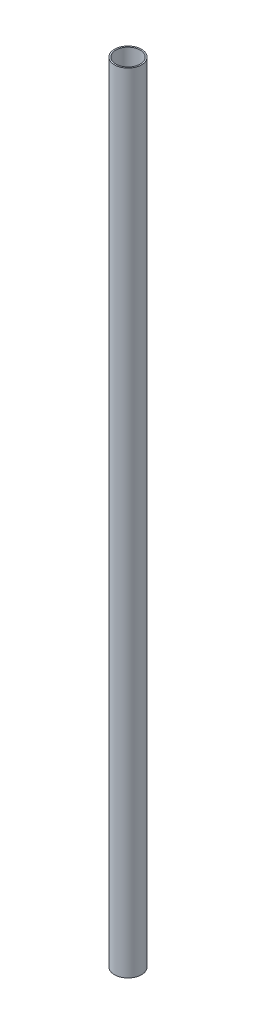
ISO-10303-21;
HEADER;
FILE_DESCRIPTION(('STEP AP214'),'2;1');
FILE_NAME('part.step','',(''),(''),'','','');
FILE_SCHEMA(('AUTOMOTIVE_DESIGN { 1 0 10303 214 1 1 1 1 }'));
ENDSEC;
DATA;
#1=APPLICATION_CONTEXT('core data for automotive mechanical design processes');
#2=APPLICATION_PROTOCOL_DEFINITION('international standard','automotive_design',2000,#1);
#3=PRODUCT_CONTEXT('',#1,'mechanical');
#4=PRODUCT('Part','Part','',(#3));
#5=PRODUCT_RELATED_PRODUCT_CATEGORY('part','',(#4));
#6=PRODUCT_DEFINITION_FORMATION('','',#4);
#7=PRODUCT_DEFINITION_CONTEXT('part definition',#1,'design');
#8=PRODUCT_DEFINITION('design','',#6,#7);
#9=PRODUCT_DEFINITION_SHAPE('','',#8);
#10=(LENGTH_UNIT() NAMED_UNIT(*) SI_UNIT(.MILLI.,.METRE.));
#11=(NAMED_UNIT(*) PLANE_ANGLE_UNIT() SI_UNIT($,.RADIAN.));
#12=(NAMED_UNIT(*) SI_UNIT($,.STERADIAN.) SOLID_ANGLE_UNIT());
#13=UNCERTAINTY_MEASURE_WITH_UNIT(LENGTH_MEASURE(1.E-05),#10,'distance_accuracy_value','');
#14=(GEOMETRIC_REPRESENTATION_CONTEXT(3) GLOBAL_UNCERTAINTY_ASSIGNED_CONTEXT((#13)) GLOBAL_UNIT_ASSIGNED_CONTEXT((#10,
#11,#12)) REPRESENTATION_CONTEXT('',''));
#15=CARTESIAN_POINT('',(0.,0.,0.));
#16=DIRECTION('',(0.,0.,1.));
#17=DIRECTION('',(1.,0.,0.));
#18=AXIS2_PLACEMENT_3D('',#15,#16,#17);
#19=CARTESIAN_POINT('',(0.,0.,0.));
#20=DIRECTION('',(0.,1.,0.));
#21=DIRECTION('',(0.,0.,1.));
#22=AXIS2_PLACEMENT_3D('',#19,#20,#21);
#23=PLANE('',#22);
#24=CARTESIAN_POINT('',(0.,0.,0.));
#25=DIRECTION('',(0.,1.,0.));
#26=DIRECTION('',(0.,0.,1.));
#27=AXIS2_PLACEMENT_3D('',#24,#25,#26);
#28=CIRCLE('',#27,4.5);
#29=CARTESIAN_POINT('',(0.,0.,4.5));
#30=VERTEX_POINT('',#29);
#31=EDGE_CURVE('E54',#30,#30,#28,.T.);
#32=ORIENTED_EDGE('',*,*,#31,.T.);
#33=EDGE_LOOP('',(#32));
#34=FACE_BOUND('',#33,.T.);
#35=CARTESIAN_POINT('',(0.,0.,0.));
#36=DIRECTION('',(0.,1.,0.));
#37=DIRECTION('',(0.,0.,1.));
#38=AXIS2_PLACEMENT_3D('',#35,#36,#37);
#39=CIRCLE('',#38,5.);
#40=CARTESIAN_POINT('',(0.,0.,5.));
#41=VERTEX_POINT('',#40);
#42=EDGE_CURVE('E50',#41,#41,#39,.T.);
#43=ORIENTED_EDGE('',*,*,#42,.F.);
#44=EDGE_LOOP('',(#43));
#45=FACE_BOUND('',#44,.T.);
#46=ADVANCED_FACE('F41',(#34,#45),#23,.F.);
#47=CARTESIAN_POINT('',(0.,291.,0.));
#48=DIRECTION('',(0.,1.,0.));
#49=DIRECTION('',(0.,0.,1.));
#50=AXIS2_PLACEMENT_3D('',#47,#48,#49);
#51=PLANE('',#50);
#52=CARTESIAN_POINT('',(0.,291.,0.));
#53=DIRECTION('',(0.,1.,0.));
#54=DIRECTION('',(0.,0.,1.));
#55=AXIS2_PLACEMENT_3D('',#52,#53,#54);
#56=CIRCLE('',#55,4.5);
#57=CARTESIAN_POINT('',(0.,291.,4.5));
#58=VERTEX_POINT('',#57);
#59=EDGE_CURVE('E51',#58,#58,#56,.T.);
#60=ORIENTED_EDGE('',*,*,#59,.F.);
#61=EDGE_LOOP('',(#60));
#62=FACE_BOUND('',#61,.T.);
#63=CARTESIAN_POINT('',(0.,291.,0.));
#64=DIRECTION('',(0.,1.,0.));
#65=DIRECTION('',(0.,0.,1.));
#66=AXIS2_PLACEMENT_3D('',#63,#64,#65);
#67=CIRCLE('',#66,5.);
#68=CARTESIAN_POINT('',(0.,291.,5.));
#69=VERTEX_POINT('',#68);
#70=EDGE_CURVE('E10',#69,#69,#67,.T.);
#71=ORIENTED_EDGE('',*,*,#70,.T.);
#72=EDGE_LOOP('',(#71));
#73=FACE_BOUND('',#72,.T.);
#74=ADVANCED_FACE('F73',(#62,#73),#51,.T.);
#75=CARTESIAN_POINT('',(0.,0.,0.));
#76=DIRECTION('',(0.,1.,0.));
#77=DIRECTION('',(0.,0.,1.));
#78=AXIS2_PLACEMENT_3D('',#75,#76,#77);
#79=CYLINDRICAL_SURFACE('',#78,5.);
#80=ORIENTED_EDGE('',*,*,#70,.F.);
#81=EDGE_LOOP('',(#80));
#82=FACE_BOUND('',#81,.T.);
#83=ORIENTED_EDGE('',*,*,#42,.T.);
#84=EDGE_LOOP('',(#83));
#85=FACE_BOUND('',#84,.T.);
#86=ADVANCED_FACE('F64',(#82,#85),#79,.T.);
#87=CARTESIAN_POINT('',(0.,0.,0.));
#88=DIRECTION('',(0.,1.,0.));
#89=DIRECTION('',(0.,0.,1.));
#90=AXIS2_PLACEMENT_3D('',#87,#88,#89);
#91=CYLINDRICAL_SURFACE('',#90,4.5);
#92=ORIENTED_EDGE('',*,*,#59,.T.);
#93=EDGE_LOOP('',(#92));
#94=FACE_BOUND('',#93,.T.);
#95=ORIENTED_EDGE('',*,*,#31,.F.);
#96=EDGE_LOOP('',(#95));
#97=FACE_BOUND('',#96,.T.);
#98=ADVANCED_FACE('F61',(#94,#97),#91,.F.);
#99=CLOSED_SHELL('',(#46,#74,#86,#98));
#100=MANIFOLD_SOLID_BREP('B2',#99);
#101=ADVANCED_BREP_SHAPE_REPRESENTATION('',(#18,#100),#14);
#102=SHAPE_DEFINITION_REPRESENTATION(#9,#101);
ENDSEC;
END-ISO-10303-21;
